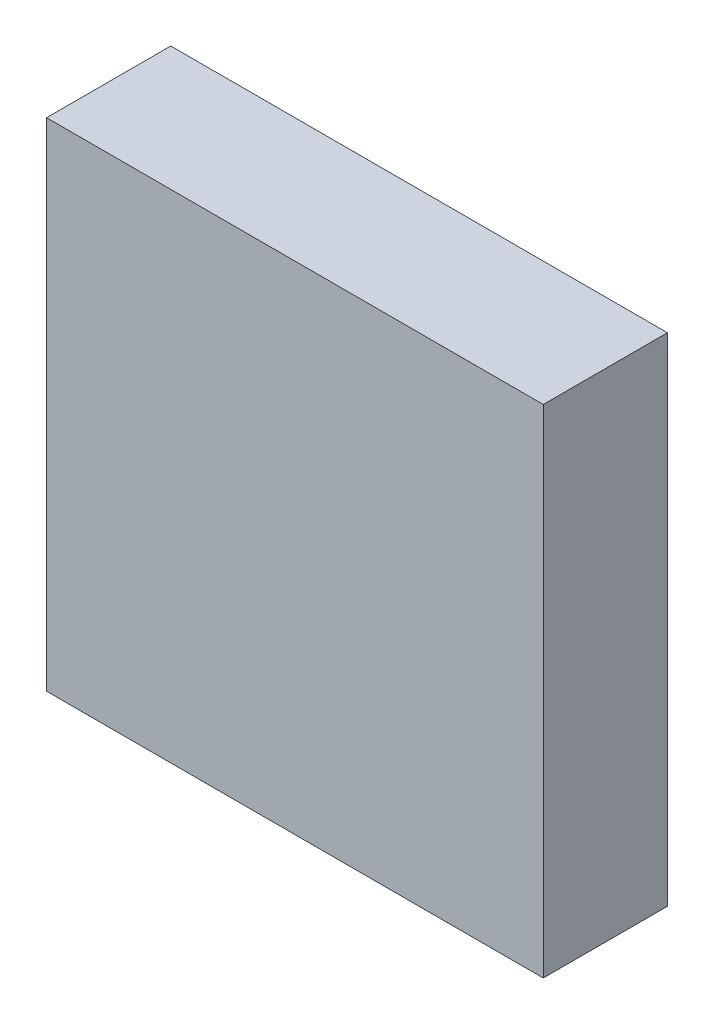
ISO-10303-21;
HEADER;
FILE_DESCRIPTION(('STEP AP214'),'2;1');
FILE_NAME('part.step','',(''),(''),'','','');
FILE_SCHEMA(('AUTOMOTIVE_DESIGN { 1 0 10303 214 1 1 1 1 }'));
ENDSEC;
DATA;
#1=APPLICATION_CONTEXT('core data for automotive mechanical design processes');
#2=APPLICATION_PROTOCOL_DEFINITION('international standard','automotive_design',2000,#1);
#3=PRODUCT_CONTEXT('',#1,'mechanical');
#4=PRODUCT('Part','Part','',(#3));
#5=PRODUCT_RELATED_PRODUCT_CATEGORY('part','',(#4));
#6=PRODUCT_DEFINITION_FORMATION('','',#4);
#7=PRODUCT_DEFINITION_CONTEXT('part definition',#1,'design');
#8=PRODUCT_DEFINITION('design','',#6,#7);
#9=PRODUCT_DEFINITION_SHAPE('','',#8);
#10=(LENGTH_UNIT() NAMED_UNIT(*) SI_UNIT(.MILLI.,.METRE.));
#11=(NAMED_UNIT(*) PLANE_ANGLE_UNIT() SI_UNIT($,.RADIAN.));
#12=(NAMED_UNIT(*) SI_UNIT($,.STERADIAN.) SOLID_ANGLE_UNIT());
#13=UNCERTAINTY_MEASURE_WITH_UNIT(LENGTH_MEASURE(1.E-05),#10,'distance_accuracy_value','');
#14=(GEOMETRIC_REPRESENTATION_CONTEXT(3) GLOBAL_UNCERTAINTY_ASSIGNED_CONTEXT((#13)) GLOBAL_UNIT_ASSIGNED_CONTEXT((#10,
#11,#12)) REPRESENTATION_CONTEXT('',''));
#15=CARTESIAN_POINT('',(0.,0.,0.));
#16=DIRECTION('',(0.,0.,1.));
#17=DIRECTION('',(1.,0.,0.));
#18=AXIS2_PLACEMENT_3D('',#15,#16,#17);
#19=CARTESIAN_POINT('',(6.47684699205042,-2.10518780630666,3.175));
#20=DIRECTION('',(-1.,0.,0.));
#21=DIRECTION('',(0.,0.,1.));
#22=AXIS2_PLACEMENT_3D('',#19,#20,#21);
#23=PLANE('',#22);
#24=DIRECTION('',(0.,1.,0.));
#25=VECTOR('',#24,1.);
#26=CARTESIAN_POINT('',(6.47684699205042,-2.10518780630666,0.));
#27=LINE('',#26,#25);
#28=CARTESIAN_POINT('',(6.47684699205042,-2.10518780630666,0.));
#29=VERTEX_POINT('',#28);
#30=CARTESIAN_POINT('',(6.47684699205042,10.5948121936933,0.));
#31=VERTEX_POINT('',#30);
#32=EDGE_CURVE('E97',#29,#31,#27,.T.);
#33=ORIENTED_EDGE('',*,*,#32,.T.);
#34=DIRECTION('',(0.,0.,-1.));
#35=VECTOR('',#34,1.);
#36=CARTESIAN_POINT('',(6.47684699205042,10.5948121936933,3.175));
#37=LINE('',#36,#35);
#38=CARTESIAN_POINT('',(6.47684699205042,10.5948121936933,3.175));
#39=VERTEX_POINT('',#38);
#40=EDGE_CURVE('E11',#39,#31,#37,.T.);
#41=ORIENTED_EDGE('',*,*,#40,.F.);
#42=DIRECTION('',(0.,1.,0.));
#43=VECTOR('',#42,1.);
#44=CARTESIAN_POINT('',(6.47684699205042,-2.10518780630666,3.175));
#45=LINE('',#44,#43);
#46=CARTESIAN_POINT('',(6.47684699205042,-2.10518780630666,3.175));
#47=VERTEX_POINT('',#46);
#48=EDGE_CURVE('E85',#47,#39,#45,.T.);
#49=ORIENTED_EDGE('',*,*,#48,.F.);
#50=DIRECTION('',(0.,0.,-1.));
#51=VECTOR('',#50,1.);
#52=CARTESIAN_POINT('',(6.47684699205042,-2.10518780630666,3.175));
#53=LINE('',#52,#51);
#54=EDGE_CURVE('E93',#47,#29,#53,.T.);
#55=ORIENTED_EDGE('',*,*,#54,.T.);
#56=EDGE_LOOP('',(#33,#41,#49,#55));
#57=FACE_BOUND('',#56,.T.);
#58=ADVANCED_FACE('F34',(#57),#23,.F.);
#59=CARTESIAN_POINT('',(6.47684699205042,10.5948121936933,3.175));
#60=DIRECTION('',(0.,-1.,0.));
#61=DIRECTION('',(0.,0.,-1.));
#62=AXIS2_PLACEMENT_3D('',#59,#60,#61);
#63=PLANE('',#62);
#64=DIRECTION('',(-1.,0.,0.));
#65=VECTOR('',#64,1.);
#66=CARTESIAN_POINT('',(6.47684699205042,10.5948121936933,0.));
#67=LINE('',#66,#65);
#68=CARTESIAN_POINT('',(-6.22315300794958,10.5948121936933,0.));
#69=VERTEX_POINT('',#68);
#70=EDGE_CURVE('E89',#31,#69,#67,.T.);
#71=ORIENTED_EDGE('',*,*,#70,.T.);
#72=DIRECTION('',(0.,0.,-1.));
#73=VECTOR('',#72,1.);
#74=CARTESIAN_POINT('',(-6.22315300794958,10.5948121936933,3.175));
#75=LINE('',#74,#73);
#76=CARTESIAN_POINT('',(-6.22315300794958,10.5948121936933,3.175));
#77=VERTEX_POINT('',#76);
#78=EDGE_CURVE('E42',#77,#69,#75,.T.);
#79=ORIENTED_EDGE('',*,*,#78,.F.);
#80=DIRECTION('',(-1.,0.,0.));
#81=VECTOR('',#80,1.);
#82=CARTESIAN_POINT('',(6.47684699205042,10.5948121936933,3.175));
#83=LINE('',#82,#81);
#84=EDGE_CURVE('E80',#39,#77,#83,.T.);
#85=ORIENTED_EDGE('',*,*,#84,.F.);
#86=ORIENTED_EDGE('',*,*,#40,.T.);
#87=EDGE_LOOP('',(#71,#79,#85,#86));
#88=FACE_BOUND('',#87,.T.);
#89=ADVANCED_FACE('F88',(#88),#63,.F.);
#90=CARTESIAN_POINT('',(-6.22315300794958,-2.10518780630666,3.175));
#91=DIRECTION('',(1.,0.,0.));
#92=DIRECTION('',(0.,0.,-1.));
#93=AXIS2_PLACEMENT_3D('',#90,#91,#92);
#94=PLANE('',#93);
#95=DIRECTION('',(0.,-1.,0.));
#96=VECTOR('',#95,1.);
#97=CARTESIAN_POINT('',(-6.22315300794958,-2.10518780630666,0.));
#98=LINE('',#97,#96);
#99=CARTESIAN_POINT('',(-6.22315300794958,-2.10518780630666,0.));
#100=VERTEX_POINT('',#99);
#101=EDGE_CURVE('E67',#69,#100,#98,.T.);
#102=ORIENTED_EDGE('',*,*,#101,.T.);
#103=DIRECTION('',(0.,0.,-1.));
#104=VECTOR('',#103,1.);
#105=CARTESIAN_POINT('',(-6.22315300794958,-2.10518780630666,3.175));
#106=LINE('',#105,#104);
#107=CARTESIAN_POINT('',(-6.22315300794958,-2.10518780630666,3.175));
#108=VERTEX_POINT('',#107);
#109=EDGE_CURVE('E90',#108,#100,#106,.T.);
#110=ORIENTED_EDGE('',*,*,#109,.F.);
#111=DIRECTION('',(0.,-1.,0.));
#112=VECTOR('',#111,1.);
#113=CARTESIAN_POINT('',(-6.22315300794958,-2.10518780630666,3.175));
#114=LINE('',#113,#112);
#115=EDGE_CURVE('E83',#77,#108,#114,.T.);
#116=ORIENTED_EDGE('',*,*,#115,.F.);
#117=ORIENTED_EDGE('',*,*,#78,.T.);
#118=EDGE_LOOP('',(#102,#110,#116,#117));
#119=FACE_BOUND('',#118,.T.);
#120=ADVANCED_FACE('F91',(#119),#94,.F.);
#121=CARTESIAN_POINT('',(6.47684699205042,-2.10518780630666,3.175));
#122=DIRECTION('',(0.,1.,0.));
#123=DIRECTION('',(-1.,0.,0.));
#124=AXIS2_PLACEMENT_3D('',#121,#122,#123);
#125=PLANE('',#124);
#126=DIRECTION('',(1.,0.,0.));
#127=VECTOR('',#126,1.);
#128=CARTESIAN_POINT('',(6.47684699205042,-2.10518780630666,0.));
#129=LINE('',#128,#127);
#130=EDGE_CURVE('E73',#100,#29,#129,.T.);
#131=ORIENTED_EDGE('',*,*,#130,.T.);
#132=ORIENTED_EDGE('',*,*,#54,.F.);
#133=DIRECTION('',(1.,0.,0.));
#134=VECTOR('',#133,1.);
#135=CARTESIAN_POINT('',(6.47684699205042,-2.10518780630666,3.175));
#136=LINE('',#135,#134);
#137=EDGE_CURVE('E50',#108,#47,#136,.T.);
#138=ORIENTED_EDGE('',*,*,#137,.F.);
#139=ORIENTED_EDGE('',*,*,#109,.T.);
#140=EDGE_LOOP('',(#131,#132,#138,#139));
#141=FACE_BOUND('',#140,.T.);
#142=ADVANCED_FACE('F104',(#141),#125,.F.);
#143=CARTESIAN_POINT('',(0.,0.,3.175));
#144=DIRECTION('',(0.,0.,1.));
#145=DIRECTION('',(1.,0.,0.));
#146=AXIS2_PLACEMENT_3D('',#143,#144,#145);
#147=PLANE('',#146);
#148=ORIENTED_EDGE('',*,*,#48,.T.);
#149=ORIENTED_EDGE('',*,*,#84,.T.);
#150=ORIENTED_EDGE('',*,*,#115,.T.);
#151=ORIENTED_EDGE('',*,*,#137,.T.);
#152=EDGE_LOOP('',(#148,#149,#150,#151));
#153=FACE_BOUND('',#152,.T.);
#154=ADVANCED_FACE('F81',(#153),#147,.T.);
#155=CARTESIAN_POINT('',(0.,0.,0.));
#156=DIRECTION('',(0.,0.,1.));
#157=DIRECTION('',(1.,0.,0.));
#158=AXIS2_PLACEMENT_3D('',#155,#156,#157);
#159=PLANE('',#158);
#160=ORIENTED_EDGE('',*,*,#32,.F.);
#161=ORIENTED_EDGE('',*,*,#130,.F.);
#162=ORIENTED_EDGE('',*,*,#101,.F.);
#163=ORIENTED_EDGE('',*,*,#70,.F.);
#164=EDGE_LOOP('',(#160,#161,#162,#163));
#165=FACE_BOUND('',#164,.T.);
#166=ADVANCED_FACE('F107',(#165),#159,.F.);
#167=CLOSED_SHELL('',(#58,#89,#120,#142,#154,#166));
#168=MANIFOLD_SOLID_BREP('B2',#167);
#169=ADVANCED_BREP_SHAPE_REPRESENTATION('',(#18,#168),#14);
#170=SHAPE_DEFINITION_REPRESENTATION(#9,#169);
ENDSEC;
END-ISO-10303-21;
